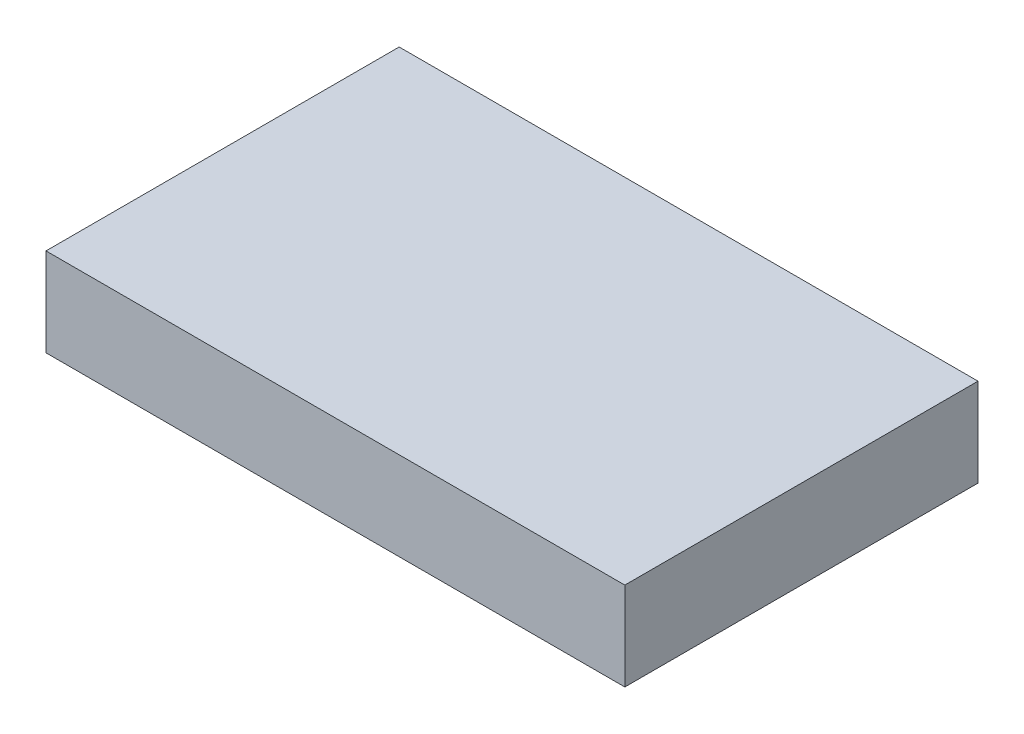
ISO-10303-21;
HEADER;
FILE_DESCRIPTION(('STEP AP214'),'2;1');
FILE_NAME('part.step','',(''),(''),'','','');
FILE_SCHEMA(('AUTOMOTIVE_DESIGN { 1 0 10303 214 1 1 1 1 }'));
ENDSEC;
DATA;
#1=APPLICATION_CONTEXT('core data for automotive mechanical design processes');
#2=APPLICATION_PROTOCOL_DEFINITION('international standard','automotive_design',2000,#1);
#3=PRODUCT_CONTEXT('',#1,'mechanical');
#4=PRODUCT('Part','Part','',(#3));
#5=PRODUCT_RELATED_PRODUCT_CATEGORY('part','',(#4));
#6=PRODUCT_DEFINITION_FORMATION('','',#4);
#7=PRODUCT_DEFINITION_CONTEXT('part definition',#1,'design');
#8=PRODUCT_DEFINITION('design','',#6,#7);
#9=PRODUCT_DEFINITION_SHAPE('','',#8);
#10=(LENGTH_UNIT() NAMED_UNIT(*) SI_UNIT(.MILLI.,.METRE.));
#11=(NAMED_UNIT(*) PLANE_ANGLE_UNIT() SI_UNIT($,.RADIAN.));
#12=(NAMED_UNIT(*) SI_UNIT($,.STERADIAN.) SOLID_ANGLE_UNIT());
#13=UNCERTAINTY_MEASURE_WITH_UNIT(LENGTH_MEASURE(1.E-05),#10,'distance_accuracy_value','');
#14=(GEOMETRIC_REPRESENTATION_CONTEXT(3) GLOBAL_UNCERTAINTY_ASSIGNED_CONTEXT((#13)) GLOBAL_UNIT_ASSIGNED_CONTEXT((#10,
#11,#12)) REPRESENTATION_CONTEXT('',''));
#15=CARTESIAN_POINT('',(0.,0.,0.));
#16=DIRECTION('',(0.,0.,1.));
#17=DIRECTION('',(1.,0.,0.));
#18=AXIS2_PLACEMENT_3D('',#15,#16,#17);
#19=CARTESIAN_POINT('',(29.5,9.,-18.));
#20=DIRECTION('',(-1.,0.,0.));
#21=DIRECTION('',(0.,0.,1.));
#22=AXIS2_PLACEMENT_3D('',#19,#20,#21);
#23=PLANE('',#22);
#24=DIRECTION('',(0.,0.,-1.));
#25=VECTOR('',#24,1.);
#26=CARTESIAN_POINT('',(29.5,0.,-18.));
#27=LINE('',#26,#25);
#28=CARTESIAN_POINT('',(29.5,0.,18.));
#29=VERTEX_POINT('',#28);
#30=CARTESIAN_POINT('',(29.5,0.,-18.));
#31=VERTEX_POINT('',#30);
#32=EDGE_CURVE('E113',#29,#31,#27,.T.);
#33=ORIENTED_EDGE('',*,*,#32,.T.);
#34=DIRECTION('',(0.,-1.,0.));
#35=VECTOR('',#34,1.);
#36=CARTESIAN_POINT('',(29.5,9.,-18.));
#37=LINE('',#36,#35);
#38=CARTESIAN_POINT('',(29.5,9.,-18.));
#39=VERTEX_POINT('',#38);
#40=EDGE_CURVE('E11',#39,#31,#37,.T.);
#41=ORIENTED_EDGE('',*,*,#40,.F.);
#42=DIRECTION('',(0.,0.,-1.));
#43=VECTOR('',#42,1.);
#44=CARTESIAN_POINT('',(29.5,9.,-18.));
#45=LINE('',#44,#43);
#46=CARTESIAN_POINT('',(29.5,9.,18.));
#47=VERTEX_POINT('',#46);
#48=EDGE_CURVE('E97',#47,#39,#45,.T.);
#49=ORIENTED_EDGE('',*,*,#48,.F.);
#50=DIRECTION('',(0.,-1.,0.));
#51=VECTOR('',#50,1.);
#52=CARTESIAN_POINT('',(29.5,9.,18.));
#53=LINE('',#52,#51);
#54=EDGE_CURVE('E109',#47,#29,#53,.T.);
#55=ORIENTED_EDGE('',*,*,#54,.T.);
#56=EDGE_LOOP('',(#33,#41,#49,#55));
#57=FACE_BOUND('',#56,.T.);
#58=ADVANCED_FACE('F45',(#57),#23,.F.);
#59=CARTESIAN_POINT('',(-29.5,9.,-18.));
#60=DIRECTION('',(0.,0.,1.));
#61=DIRECTION('',(1.,0.,0.));
#62=AXIS2_PLACEMENT_3D('',#59,#60,#61);
#63=PLANE('',#62);
#64=DIRECTION('',(-1.,0.,0.));
#65=VECTOR('',#64,1.);
#66=CARTESIAN_POINT('',(-29.5,0.,-18.));
#67=LINE('',#66,#65);
#68=CARTESIAN_POINT('',(-29.5,0.,-18.));
#69=VERTEX_POINT('',#68);
#70=EDGE_CURVE('E102',#31,#69,#67,.T.);
#71=ORIENTED_EDGE('',*,*,#70,.T.);
#72=DIRECTION('',(0.,-1.,0.));
#73=VECTOR('',#72,1.);
#74=CARTESIAN_POINT('',(-29.5,9.,-18.));
#75=LINE('',#74,#73);
#76=CARTESIAN_POINT('',(-29.5,9.,-18.));
#77=VERTEX_POINT('',#76);
#78=EDGE_CURVE('E54',#77,#69,#75,.T.);
#79=ORIENTED_EDGE('',*,*,#78,.F.);
#80=DIRECTION('',(-1.,0.,0.));
#81=VECTOR('',#80,1.);
#82=CARTESIAN_POINT('',(-29.5,9.,-18.));
#83=LINE('',#82,#81);
#84=EDGE_CURVE('E92',#39,#77,#83,.T.);
#85=ORIENTED_EDGE('',*,*,#84,.F.);
#86=ORIENTED_EDGE('',*,*,#40,.T.);
#87=EDGE_LOOP('',(#71,#79,#85,#86));
#88=FACE_BOUND('',#87,.T.);
#89=ADVANCED_FACE('F101',(#88),#63,.F.);
#90=CARTESIAN_POINT('',(-29.5,9.,-18.));
#91=DIRECTION('',(1.,0.,0.));
#92=DIRECTION('',(0.,0.,-1.));
#93=AXIS2_PLACEMENT_3D('',#90,#91,#92);
#94=PLANE('',#93);
#95=DIRECTION('',(0.,0.,1.));
#96=VECTOR('',#95,1.);
#97=CARTESIAN_POINT('',(-29.5,0.,-18.));
#98=LINE('',#97,#96);
#99=CARTESIAN_POINT('',(-29.5,0.,18.));
#100=VERTEX_POINT('',#99);
#101=EDGE_CURVE('E79',#69,#100,#98,.T.);
#102=ORIENTED_EDGE('',*,*,#101,.T.);
#103=DIRECTION('',(0.,-1.,0.));
#104=VECTOR('',#103,1.);
#105=CARTESIAN_POINT('',(-29.5,9.,18.));
#106=LINE('',#105,#104);
#107=CARTESIAN_POINT('',(-29.5,9.,18.));
#108=VERTEX_POINT('',#107);
#109=EDGE_CURVE('E104',#108,#100,#106,.T.);
#110=ORIENTED_EDGE('',*,*,#109,.F.);
#111=DIRECTION('',(0.,0.,1.));
#112=VECTOR('',#111,1.);
#113=CARTESIAN_POINT('',(-29.5,9.,-18.));
#114=LINE('',#113,#112);
#115=EDGE_CURVE('E95',#77,#108,#114,.T.);
#116=ORIENTED_EDGE('',*,*,#115,.F.);
#117=ORIENTED_EDGE('',*,*,#78,.T.);
#118=EDGE_LOOP('',(#102,#110,#116,#117));
#119=FACE_BOUND('',#118,.T.);
#120=ADVANCED_FACE('F105',(#119),#94,.F.);
#121=CARTESIAN_POINT('',(-29.5,9.,18.));
#122=DIRECTION('',(0.,0.,-1.));
#123=DIRECTION('',(-1.,0.,0.));
#124=AXIS2_PLACEMENT_3D('',#121,#122,#123);
#125=PLANE('',#124);
#126=DIRECTION('',(1.,0.,0.));
#127=VECTOR('',#126,1.);
#128=CARTESIAN_POINT('',(-29.5,0.,18.));
#129=LINE('',#128,#127);
#130=EDGE_CURVE('E85',#100,#29,#129,.T.);
#131=ORIENTED_EDGE('',*,*,#130,.T.);
#132=ORIENTED_EDGE('',*,*,#54,.F.);
#133=DIRECTION('',(1.,0.,0.));
#134=VECTOR('',#133,1.);
#135=CARTESIAN_POINT('',(-29.5,9.,18.));
#136=LINE('',#135,#134);
#137=EDGE_CURVE('E62',#108,#47,#136,.T.);
#138=ORIENTED_EDGE('',*,*,#137,.F.);
#139=ORIENTED_EDGE('',*,*,#109,.T.);
#140=EDGE_LOOP('',(#131,#132,#138,#139));
#141=FACE_BOUND('',#140,.T.);
#142=ADVANCED_FACE('F126',(#141),#125,.F.);
#143=CARTESIAN_POINT('',(0.,9.,0.));
#144=DIRECTION('',(0.,1.,0.));
#145=DIRECTION('',(0.,0.,1.));
#146=AXIS2_PLACEMENT_3D('',#143,#144,#145);
#147=PLANE('',#146);
#148=ORIENTED_EDGE('',*,*,#48,.T.);
#149=ORIENTED_EDGE('',*,*,#84,.T.);
#150=ORIENTED_EDGE('',*,*,#115,.T.);
#151=ORIENTED_EDGE('',*,*,#137,.T.);
#152=EDGE_LOOP('',(#148,#149,#150,#151));
#153=FACE_BOUND('',#152,.T.);
#154=ADVANCED_FACE('F93',(#153),#147,.T.);
#155=CARTESIAN_POINT('',(0.,0.,0.));
#156=DIRECTION('',(0.,1.,0.));
#157=DIRECTION('',(0.,0.,1.));
#158=AXIS2_PLACEMENT_3D('',#155,#156,#157);
#159=PLANE('',#158);
#160=ORIENTED_EDGE('',*,*,#32,.F.);
#161=ORIENTED_EDGE('',*,*,#130,.F.);
#162=ORIENTED_EDGE('',*,*,#101,.F.);
#163=ORIENTED_EDGE('',*,*,#70,.F.);
#164=EDGE_LOOP('',(#160,#161,#162,#163));
#165=FACE_BOUND('',#164,.T.);
#166=ADVANCED_FACE('F129',(#165),#159,.F.);
#167=CLOSED_SHELL('',(#58,#89,#120,#142,#154,#166));
#168=MANIFOLD_SOLID_BREP('B2',#167);
#169=ADVANCED_BREP_SHAPE_REPRESENTATION('',(#18,#168),#14);
#170=SHAPE_DEFINITION_REPRESENTATION(#9,#169);
ENDSEC;
END-ISO-10303-21;
